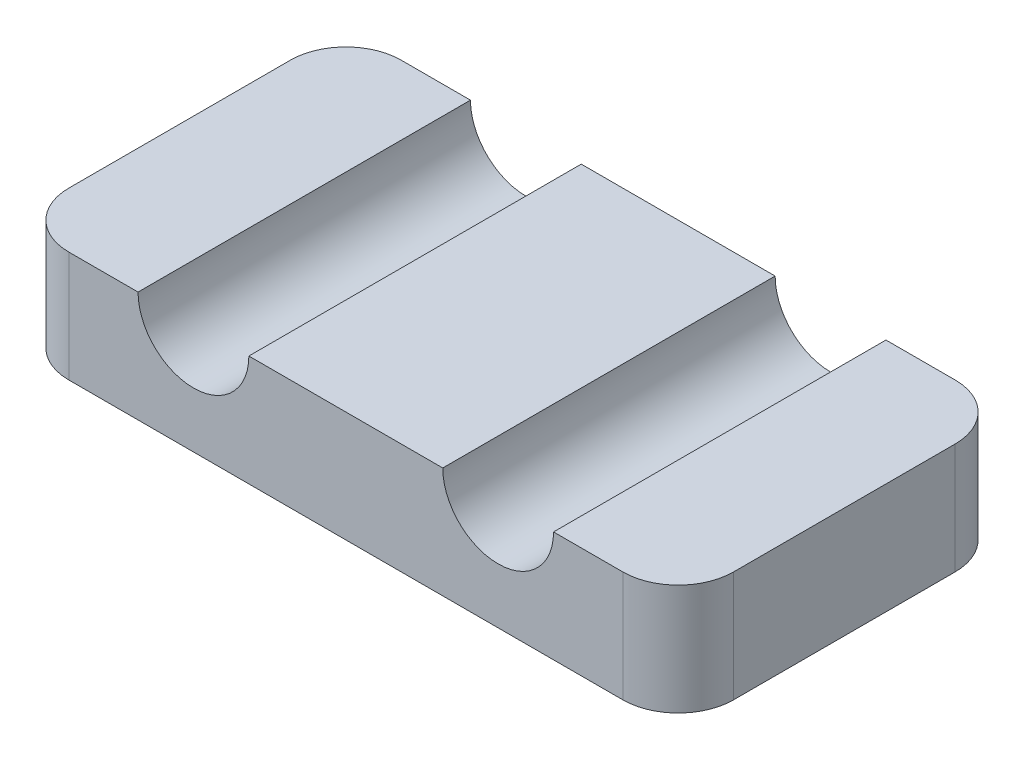
ISO-10303-21;
HEADER;
FILE_DESCRIPTION(('STEP AP214'),'2;1');
FILE_NAME('part.step','',(''),(''),'','','');
FILE_SCHEMA(('AUTOMOTIVE_DESIGN { 1 0 10303 214 1 1 1 1 }'));
ENDSEC;
DATA;
#1=APPLICATION_CONTEXT('core data for automotive mechanical design processes');
#2=APPLICATION_PROTOCOL_DEFINITION('international standard','automotive_design',2000,#1);
#3=PRODUCT_CONTEXT('',#1,'mechanical');
#4=PRODUCT('Part','Part','',(#3));
#5=PRODUCT_RELATED_PRODUCT_CATEGORY('part','',(#4));
#6=PRODUCT_DEFINITION_FORMATION('','',#4);
#7=PRODUCT_DEFINITION_CONTEXT('part definition',#1,'design');
#8=PRODUCT_DEFINITION('design','',#6,#7);
#9=PRODUCT_DEFINITION_SHAPE('','',#8);
#10=(LENGTH_UNIT() NAMED_UNIT(*) SI_UNIT(.MILLI.,.METRE.));
#11=(NAMED_UNIT(*) PLANE_ANGLE_UNIT() SI_UNIT($,.RADIAN.));
#12=(NAMED_UNIT(*) SI_UNIT($,.STERADIAN.) SOLID_ANGLE_UNIT());
#13=UNCERTAINTY_MEASURE_WITH_UNIT(LENGTH_MEASURE(1.E-05),#10,'distance_accuracy_value','');
#14=(GEOMETRIC_REPRESENTATION_CONTEXT(3) GLOBAL_UNCERTAINTY_ASSIGNED_CONTEXT((#13)) GLOBAL_UNIT_ASSIGNED_CONTEXT((#10,
#11,#12)) REPRESENTATION_CONTEXT('',''));
#15=CARTESIAN_POINT('',(0.,0.,0.));
#16=DIRECTION('',(0.,0.,1.));
#17=DIRECTION('',(1.,0.,0.));
#18=AXIS2_PLACEMENT_3D('',#15,#16,#17);
#19=CARTESIAN_POINT('',(69.85,25.4,76.2));
#20=DIRECTION('',(0.,0.,-1.));
#21=DIRECTION('',(-1.,0.,0.));
#22=AXIS2_PLACEMENT_3D('',#19,#20,#21);
#23=CYLINDRICAL_SURFACE('',#22,25.4);
#24=CARTESIAN_POINT('',(69.85,25.4,-76.2));
#25=DIRECTION('',(0.,0.,1.));
#26=DIRECTION('',(1.,0.,0.));
#27=AXIS2_PLACEMENT_3D('',#24,#25,#26);
#28=CIRCLE('',#27,25.4);
#29=CARTESIAN_POINT('',(44.45,25.4,-76.2));
#30=VERTEX_POINT('',#29);
#31=CARTESIAN_POINT('',(95.25,25.4,-76.2));
#32=VERTEX_POINT('',#31);
#33=EDGE_CURVE('E134',#30,#32,#28,.T.);
#34=ORIENTED_EDGE('',*,*,#33,.F.);
#35=DIRECTION('',(0.,0.,-1.));
#36=VECTOR('',#35,1.);
#37=CARTESIAN_POINT('',(44.45,25.4,76.2));
#38=LINE('',#37,#36);
#39=CARTESIAN_POINT('',(44.45,25.4,76.2));
#40=VERTEX_POINT('',#39);
#41=EDGE_CURVE('E129',#40,#30,#38,.T.);
#42=ORIENTED_EDGE('',*,*,#41,.F.);
#43=CARTESIAN_POINT('',(69.85,25.4,76.2));
#44=DIRECTION('',(0.,0.,1.));
#45=DIRECTION('',(1.,0.,0.));
#46=AXIS2_PLACEMENT_3D('',#43,#44,#45);
#47=CIRCLE('',#46,25.4);
#48=CARTESIAN_POINT('',(95.25,25.4,76.2));
#49=VERTEX_POINT('',#48);
#50=EDGE_CURVE('E131',#40,#49,#47,.T.);
#51=ORIENTED_EDGE('',*,*,#50,.T.);
#52=DIRECTION('',(0.,0.,-1.));
#53=VECTOR('',#52,1.);
#54=CARTESIAN_POINT('',(95.25,25.4,76.2));
#55=LINE('',#54,#53);
#56=EDGE_CURVE('E160',#49,#32,#55,.T.);
#57=ORIENTED_EDGE('',*,*,#56,.T.);
#58=EDGE_LOOP('',(#34,#42,#51,#57));
#59=FACE_BOUND('',#58,.T.);
#60=ADVANCED_FACE('F39',(#59),#23,.F.);
#61=CARTESIAN_POINT('',(0.,25.4,76.2));
#62=DIRECTION('',(0.,1.,0.));
#63=DIRECTION('',(0.,0.,1.));
#64=AXIS2_PLACEMENT_3D('',#61,#62,#63);
#65=PLANE('',#64);
#66=DIRECTION('',(1.,0.,0.));
#67=VECTOR('',#66,1.);
#68=CARTESIAN_POINT('',(0.,25.4,-76.2));
#69=LINE('',#68,#67);
#70=CARTESIAN_POINT('',(-44.45,25.4,-76.2));
#71=VERTEX_POINT('',#70);
#72=EDGE_CURVE('E169',#71,#30,#69,.T.);
#73=ORIENTED_EDGE('',*,*,#72,.F.);
#74=DIRECTION('',(0.,0.,-1.));
#75=VECTOR('',#74,1.);
#76=CARTESIAN_POINT('',(-44.45,25.4,76.2));
#77=LINE('',#76,#75);
#78=CARTESIAN_POINT('',(-44.45,25.4,76.2));
#79=VERTEX_POINT('',#78);
#80=EDGE_CURVE('E140',#79,#71,#77,.T.);
#81=ORIENTED_EDGE('',*,*,#80,.F.);
#82=DIRECTION('',(1.,0.,0.));
#83=VECTOR('',#82,1.);
#84=CARTESIAN_POINT('',(0.,25.4,76.2));
#85=LINE('',#84,#83);
#86=EDGE_CURVE('E147',#79,#40,#85,.T.);
#87=ORIENTED_EDGE('',*,*,#86,.T.);
#88=ORIENTED_EDGE('',*,*,#41,.T.);
#89=EDGE_LOOP('',(#73,#81,#87,#88));
#90=FACE_BOUND('',#89,.T.);
#91=ADVANCED_FACE('F154',(#90),#65,.T.);
#92=CARTESIAN_POINT('',(-69.85,25.4,76.2));
#93=DIRECTION('',(0.,0.,-1.));
#94=DIRECTION('',(-1.,0.,0.));
#95=AXIS2_PLACEMENT_3D('',#92,#93,#94);
#96=CYLINDRICAL_SURFACE('',#95,25.4);
#97=CARTESIAN_POINT('',(-69.85,25.4,-76.2));
#98=DIRECTION('',(0.,0.,1.));
#99=DIRECTION('',(1.,0.,0.));
#100=AXIS2_PLACEMENT_3D('',#97,#98,#99);
#101=CIRCLE('',#100,25.4);
#102=CARTESIAN_POINT('',(-95.25,25.4,-76.2));
#103=VERTEX_POINT('',#102);
#104=EDGE_CURVE('E171',#103,#71,#101,.T.);
#105=ORIENTED_EDGE('',*,*,#104,.F.);
#106=DIRECTION('',(0.,0.,-1.));
#107=VECTOR('',#106,1.);
#108=CARTESIAN_POINT('',(-95.25,25.4,76.2));
#109=LINE('',#108,#107);
#110=CARTESIAN_POINT('',(-95.25,25.4,76.2));
#111=VERTEX_POINT('',#110);
#112=EDGE_CURVE('E188',#111,#103,#109,.T.);
#113=ORIENTED_EDGE('',*,*,#112,.F.);
#114=CARTESIAN_POINT('',(-69.85,25.4,76.2));
#115=DIRECTION('',(0.,0.,1.));
#116=DIRECTION('',(1.,0.,0.));
#117=AXIS2_PLACEMENT_3D('',#114,#115,#116);
#118=CIRCLE('',#117,25.4);
#119=EDGE_CURVE('E155',#111,#79,#118,.T.);
#120=ORIENTED_EDGE('',*,*,#119,.T.);
#121=ORIENTED_EDGE('',*,*,#80,.T.);
#122=EDGE_LOOP('',(#105,#113,#120,#121));
#123=FACE_BOUND('',#122,.T.);
#124=ADVANCED_FACE('F251',(#123),#96,.F.);
#125=CARTESIAN_POINT('',(-127.,25.4,-76.2));
#126=VERTEX_POINT('',#125);
#127=EDGE_CURVE('E172',#126,#103,#69,.T.);
#128=ORIENTED_EDGE('',*,*,#127,.F.);
#129=CARTESIAN_POINT('',(-127.,25.4,-50.8));
#130=DIRECTION('',(0.,1.,0.));
#131=DIRECTION('',(0.,0.,1.));
#132=AXIS2_PLACEMENT_3D('',#129,#130,#131);
#133=CIRCLE('',#132,25.4);
#134=CARTESIAN_POINT('',(-152.4,25.4,-50.7999999999999));
#135=VERTEX_POINT('',#134);
#136=EDGE_CURVE('E54',#126,#135,#133,.T.);
#137=ORIENTED_EDGE('',*,*,#136,.T.);
#138=DIRECTION('',(0.,0.,-1.));
#139=VECTOR('',#138,1.);
#140=CARTESIAN_POINT('',(-152.4,25.4,76.2));
#141=LINE('',#140,#139);
#142=CARTESIAN_POINT('',(-152.4,25.4,50.8));
#143=VERTEX_POINT('',#142);
#144=EDGE_CURVE('E186',#143,#135,#141,.T.);
#145=ORIENTED_EDGE('',*,*,#144,.F.);
#146=CARTESIAN_POINT('',(-127.,25.4,50.8));
#147=DIRECTION('',(0.,1.,0.));
#148=DIRECTION('',(0.,0.,1.));
#149=AXIS2_PLACEMENT_3D('',#146,#147,#148);
#150=CIRCLE('',#149,25.4);
#151=CARTESIAN_POINT('',(-127.,25.4,76.2));
#152=VERTEX_POINT('',#151);
#153=EDGE_CURVE('E62',#143,#152,#150,.T.);
#154=ORIENTED_EDGE('',*,*,#153,.T.);
#155=EDGE_CURVE('E157',#152,#111,#85,.T.);
#156=ORIENTED_EDGE('',*,*,#155,.T.);
#157=ORIENTED_EDGE('',*,*,#112,.T.);
#158=EDGE_LOOP('',(#128,#137,#145,#154,#156,#157));
#159=FACE_BOUND('',#158,.T.);
#160=ADVANCED_FACE('F223',(#159),#65,.T.);
#161=CARTESIAN_POINT('',(-152.4,0.,76.2));
#162=DIRECTION('',(-1.,0.,0.));
#163=DIRECTION('',(0.,0.,1.));
#164=AXIS2_PLACEMENT_3D('',#161,#162,#163);
#165=PLANE('',#164);
#166=ORIENTED_EDGE('',*,*,#144,.T.);
#167=DIRECTION('',(0.,1.,0.));
#168=VECTOR('',#167,1.);
#169=CARTESIAN_POINT('',(-152.4,-25.4,-50.8));
#170=LINE('',#169,#168);
#171=CARTESIAN_POINT('',(-152.4,-25.4,-50.7999999999999));
#172=VERTEX_POINT('',#171);
#173=EDGE_CURVE('E11',#135,#172,#170,.F.);
#174=ORIENTED_EDGE('',*,*,#173,.T.);
#175=DIRECTION('',(0.,0.,-1.));
#176=VECTOR('',#175,1.);
#177=CARTESIAN_POINT('',(-152.4,-25.4,76.2));
#178=LINE('',#177,#176);
#179=CARTESIAN_POINT('',(-152.4,-25.4,50.8));
#180=VERTEX_POINT('',#179);
#181=EDGE_CURVE('E183',#180,#172,#178,.T.);
#182=ORIENTED_EDGE('',*,*,#181,.F.);
#183=DIRECTION('',(0.,1.,0.));
#184=VECTOR('',#183,1.);
#185=CARTESIAN_POINT('',(-152.4,0.,50.8));
#186=LINE('',#185,#184);
#187=EDGE_CURVE('E47',#180,#143,#186,.T.);
#188=ORIENTED_EDGE('',*,*,#187,.T.);
#189=EDGE_LOOP('',(#166,#174,#182,#188));
#190=FACE_BOUND('',#189,.T.);
#191=ADVANCED_FACE('F220',(#190),#165,.T.);
#192=CARTESIAN_POINT('',(0.,-25.4,76.2));
#193=DIRECTION('',(0.,1.,0.));
#194=DIRECTION('',(0.,0.,1.));
#195=AXIS2_PLACEMENT_3D('',#192,#193,#194);
#196=PLANE('',#195);
#197=DIRECTION('',(0.,0.,-1.));
#198=VECTOR('',#197,1.);
#199=CARTESIAN_POINT('',(152.4,-25.4,76.2));
#200=LINE('',#199,#198);
#201=CARTESIAN_POINT('',(152.4,-25.4,50.8));
#202=VERTEX_POINT('',#201);
#203=CARTESIAN_POINT('',(152.4,-25.4,-50.7999999999999));
#204=VERTEX_POINT('',#203);
#205=EDGE_CURVE('E180',#202,#204,#200,.T.);
#206=ORIENTED_EDGE('',*,*,#205,.F.);
#207=CARTESIAN_POINT('',(127.,-25.4,50.8));
#208=DIRECTION('',(0.,1.,0.));
#209=DIRECTION('',(0.,0.,1.));
#210=AXIS2_PLACEMENT_3D('',#207,#208,#209);
#211=CIRCLE('',#210,25.4);
#212=CARTESIAN_POINT('',(127.,-25.4,76.2));
#213=VERTEX_POINT('',#212);
#214=EDGE_CURVE('E210',#202,#213,#211,.F.);
#215=ORIENTED_EDGE('',*,*,#214,.T.);
#216=DIRECTION('',(1.,0.,0.));
#217=VECTOR('',#216,1.);
#218=CARTESIAN_POINT('',(0.,-25.4,76.2));
#219=LINE('',#218,#217);
#220=CARTESIAN_POINT('',(-127.,-25.4,76.2));
#221=VERTEX_POINT('',#220);
#222=EDGE_CURVE('E159',#221,#213,#219,.T.);
#223=ORIENTED_EDGE('',*,*,#222,.F.);
#224=CARTESIAN_POINT('',(-127.,-25.4,50.8));
#225=DIRECTION('',(0.,1.,0.));
#226=DIRECTION('',(0.,0.,1.));
#227=AXIS2_PLACEMENT_3D('',#224,#225,#226);
#228=CIRCLE('',#227,25.4);
#229=EDGE_CURVE('E204',#221,#180,#228,.F.);
#230=ORIENTED_EDGE('',*,*,#229,.T.);
#231=ORIENTED_EDGE('',*,*,#181,.T.);
#232=CARTESIAN_POINT('',(-127.,-25.4,-50.8));
#233=DIRECTION('',(0.,1.,0.));
#234=DIRECTION('',(0.,0.,1.));
#235=AXIS2_PLACEMENT_3D('',#232,#233,#234);
#236=CIRCLE('',#235,25.4);
#237=CARTESIAN_POINT('',(-127.,-25.4,-76.2));
#238=VERTEX_POINT('',#237);
#239=EDGE_CURVE('E206',#172,#238,#236,.F.);
#240=ORIENTED_EDGE('',*,*,#239,.T.);
#241=DIRECTION('',(1.,0.,0.));
#242=VECTOR('',#241,1.);
#243=CARTESIAN_POINT('',(0.,-25.4,-76.2));
#244=LINE('',#243,#242);
#245=CARTESIAN_POINT('',(127.,-25.4,-76.2));
#246=VERTEX_POINT('',#245);
#247=EDGE_CURVE('E175',#238,#246,#244,.T.);
#248=ORIENTED_EDGE('',*,*,#247,.T.);
#249=CARTESIAN_POINT('',(127.,-25.4,-50.8));
#250=DIRECTION('',(0.,1.,0.));
#251=DIRECTION('',(0.,0.,1.));
#252=AXIS2_PLACEMENT_3D('',#249,#250,#251);
#253=CIRCLE('',#252,25.4);
#254=EDGE_CURVE('E208',#246,#204,#253,.F.);
#255=ORIENTED_EDGE('',*,*,#254,.T.);
#256=EDGE_LOOP('',(#206,#215,#223,#230,#231,#240,#248,#255));
#257=FACE_BOUND('',#256,.T.);
#258=ADVANCED_FACE('F228',(#257),#196,.F.);
#259=CARTESIAN_POINT('',(152.4,0.,76.2));
#260=DIRECTION('',(-1.,0.,0.));
#261=DIRECTION('',(0.,0.,1.));
#262=AXIS2_PLACEMENT_3D('',#259,#260,#261);
#263=PLANE('',#262);
#264=DIRECTION('',(0.,0.,-1.));
#265=VECTOR('',#264,1.);
#266=CARTESIAN_POINT('',(152.4,25.4,76.2));
#267=LINE('',#266,#265);
#268=CARTESIAN_POINT('',(152.4,25.4,50.8));
#269=VERTEX_POINT('',#268);
#270=CARTESIAN_POINT('',(152.4,25.4,-50.7999999999999));
#271=VERTEX_POINT('',#270);
#272=EDGE_CURVE('E162',#269,#271,#267,.T.);
#273=ORIENTED_EDGE('',*,*,#272,.F.);
#274=DIRECTION('',(0.,1.,0.));
#275=VECTOR('',#274,1.);
#276=CARTESIAN_POINT('',(152.4,-25.4,50.8));
#277=LINE('',#276,#275);
#278=EDGE_CURVE('E202',#269,#202,#277,.F.);
#279=ORIENTED_EDGE('',*,*,#278,.T.);
#280=ORIENTED_EDGE('',*,*,#205,.T.);
#281=DIRECTION('',(0.,1.,0.));
#282=VECTOR('',#281,1.);
#283=CARTESIAN_POINT('',(152.4,0.,-50.8));
#284=LINE('',#283,#282);
#285=EDGE_CURVE('E199',#204,#271,#284,.T.);
#286=ORIENTED_EDGE('',*,*,#285,.T.);
#287=EDGE_LOOP('',(#273,#279,#280,#286));
#288=FACE_BOUND('',#287,.T.);
#289=ADVANCED_FACE('F237',(#288),#263,.F.);
#290=CARTESIAN_POINT('',(127.,25.4,76.2));
#291=VERTEX_POINT('',#290);
#292=EDGE_CURVE('E151',#49,#291,#85,.T.);
#293=ORIENTED_EDGE('',*,*,#292,.T.);
#294=CARTESIAN_POINT('',(127.,25.4,50.8));
#295=DIRECTION('',(0.,1.,0.));
#296=DIRECTION('',(0.,0.,1.));
#297=AXIS2_PLACEMENT_3D('',#294,#295,#296);
#298=CIRCLE('',#297,25.4);
#299=EDGE_CURVE('E197',#291,#269,#298,.T.);
#300=ORIENTED_EDGE('',*,*,#299,.T.);
#301=ORIENTED_EDGE('',*,*,#272,.T.);
#302=CARTESIAN_POINT('',(127.,25.4,-50.8));
#303=DIRECTION('',(0.,1.,0.));
#304=DIRECTION('',(0.,0.,1.));
#305=AXIS2_PLACEMENT_3D('',#302,#303,#304);
#306=CIRCLE('',#305,25.4);
#307=CARTESIAN_POINT('',(127.,25.4,-76.2));
#308=VERTEX_POINT('',#307);
#309=EDGE_CURVE('E195',#271,#308,#306,.T.);
#310=ORIENTED_EDGE('',*,*,#309,.T.);
#311=EDGE_CURVE('E152',#32,#308,#69,.T.);
#312=ORIENTED_EDGE('',*,*,#311,.F.);
#313=ORIENTED_EDGE('',*,*,#56,.F.);
#314=EDGE_LOOP('',(#293,#300,#301,#310,#312,#313));
#315=FACE_BOUND('',#314,.T.);
#316=ADVANCED_FACE('F235',(#315),#65,.T.);
#317=CARTESIAN_POINT('',(0.,0.,76.2));
#318=DIRECTION('',(0.,0.,1.));
#319=DIRECTION('',(1.,0.,0.));
#320=AXIS2_PLACEMENT_3D('',#317,#318,#319);
#321=PLANE('',#320);
#322=ORIENTED_EDGE('',*,*,#222,.T.);
#323=DIRECTION('',(0.,1.,0.));
#324=VECTOR('',#323,1.);
#325=CARTESIAN_POINT('',(127.,25.4,76.2));
#326=LINE('',#325,#324);
#327=EDGE_CURVE('E193',#213,#291,#326,.T.);
#328=ORIENTED_EDGE('',*,*,#327,.T.);
#329=ORIENTED_EDGE('',*,*,#292,.F.);
#330=ORIENTED_EDGE('',*,*,#50,.F.);
#331=ORIENTED_EDGE('',*,*,#86,.F.);
#332=ORIENTED_EDGE('',*,*,#119,.F.);
#333=ORIENTED_EDGE('',*,*,#155,.F.);
#334=DIRECTION('',(0.,1.,0.));
#335=VECTOR('',#334,1.);
#336=CARTESIAN_POINT('',(-127.,0.,76.2));
#337=LINE('',#336,#335);
#338=EDGE_CURVE('E139',#152,#221,#337,.F.);
#339=ORIENTED_EDGE('',*,*,#338,.T.);
#340=EDGE_LOOP('',(#322,#328,#329,#330,#331,#332,#333,#339));
#341=FACE_BOUND('',#340,.T.);
#342=ADVANCED_FACE('F145',(#341),#321,.T.);
#343=CARTESIAN_POINT('',(0.,0.,-76.2));
#344=DIRECTION('',(0.,0.,1.));
#345=DIRECTION('',(1.,0.,0.));
#346=AXIS2_PLACEMENT_3D('',#343,#344,#345);
#347=PLANE('',#346);
#348=ORIENTED_EDGE('',*,*,#311,.T.);
#349=DIRECTION('',(0.,1.,0.));
#350=VECTOR('',#349,1.);
#351=CARTESIAN_POINT('',(127.,0.,-76.2));
#352=LINE('',#351,#350);
#353=EDGE_CURVE('E215',#308,#246,#352,.F.);
#354=ORIENTED_EDGE('',*,*,#353,.T.);
#355=ORIENTED_EDGE('',*,*,#247,.F.);
#356=DIRECTION('',(0.,1.,0.));
#357=VECTOR('',#356,1.);
#358=CARTESIAN_POINT('',(-127.,25.4,-76.2));
#359=LINE('',#358,#357);
#360=EDGE_CURVE('E212',#238,#126,#359,.T.);
#361=ORIENTED_EDGE('',*,*,#360,.T.);
#362=ORIENTED_EDGE('',*,*,#127,.T.);
#363=ORIENTED_EDGE('',*,*,#104,.T.);
#364=ORIENTED_EDGE('',*,*,#72,.T.);
#365=ORIENTED_EDGE('',*,*,#33,.T.);
#366=EDGE_LOOP('',(#348,#354,#355,#361,#362,#363,#364,#365));
#367=FACE_BOUND('',#366,.T.);
#368=ADVANCED_FACE('F246',(#367),#347,.F.);
#369=CARTESIAN_POINT('',(127.,0.,50.8));
#370=DIRECTION('',(0.,-1.,0.));
#371=DIRECTION('',(0.,0.,-1.));
#372=AXIS2_PLACEMENT_3D('',#369,#370,#371);
#373=CYLINDRICAL_SURFACE('',#372,25.4);
#374=ORIENTED_EDGE('',*,*,#214,.F.);
#375=ORIENTED_EDGE('',*,*,#278,.F.);
#376=ORIENTED_EDGE('',*,*,#299,.F.);
#377=ORIENTED_EDGE('',*,*,#327,.F.);
#378=EDGE_LOOP('',(#374,#375,#376,#377));
#379=FACE_BOUND('',#378,.T.);
#380=ADVANCED_FACE('F233',(#379),#373,.T.);
#381=CARTESIAN_POINT('',(127.,0.,-50.8));
#382=DIRECTION('',(0.,1.,0.));
#383=DIRECTION('',(0.,0.,1.));
#384=AXIS2_PLACEMENT_3D('',#381,#382,#383);
#385=CYLINDRICAL_SURFACE('',#384,25.4);
#386=ORIENTED_EDGE('',*,*,#254,.F.);
#387=ORIENTED_EDGE('',*,*,#353,.F.);
#388=ORIENTED_EDGE('',*,*,#309,.F.);
#389=ORIENTED_EDGE('',*,*,#285,.F.);
#390=EDGE_LOOP('',(#386,#387,#388,#389));
#391=FACE_BOUND('',#390,.T.);
#392=ADVANCED_FACE('F241',(#391),#385,.T.);
#393=CARTESIAN_POINT('',(-127.,0.,-50.8));
#394=DIRECTION('',(0.,-1.,0.));
#395=DIRECTION('',(0.,0.,-1.));
#396=AXIS2_PLACEMENT_3D('',#393,#394,#395);
#397=CYLINDRICAL_SURFACE('',#396,25.4);
#398=ORIENTED_EDGE('',*,*,#239,.F.);
#399=ORIENTED_EDGE('',*,*,#173,.F.);
#400=ORIENTED_EDGE('',*,*,#136,.F.);
#401=ORIENTED_EDGE('',*,*,#360,.F.);
#402=EDGE_LOOP('',(#398,#399,#400,#401));
#403=FACE_BOUND('',#402,.T.);
#404=ADVANCED_FACE('F268',(#403),#397,.T.);
#405=CARTESIAN_POINT('',(-127.,0.,50.8));
#406=DIRECTION('',(0.,1.,0.));
#407=DIRECTION('',(0.,0.,1.));
#408=AXIS2_PLACEMENT_3D('',#405,#406,#407);
#409=CYLINDRICAL_SURFACE('',#408,25.4);
#410=ORIENTED_EDGE('',*,*,#229,.F.);
#411=ORIENTED_EDGE('',*,*,#338,.F.);
#412=ORIENTED_EDGE('',*,*,#153,.F.);
#413=ORIENTED_EDGE('',*,*,#187,.F.);
#414=EDGE_LOOP('',(#410,#411,#412,#413));
#415=FACE_BOUND('',#414,.T.);
#416=ADVANCED_FACE('F41',(#415),#409,.T.);
#417=CLOSED_SHELL('',(#60,#91,#124,#160,#191,#258,#289,#316,#342,#368,#380,#392,#404,#416));
#418=MANIFOLD_SOLID_BREP('B2',#417);
#419=ADVANCED_BREP_SHAPE_REPRESENTATION('',(#18,#418),#14);
#420=SHAPE_DEFINITION_REPRESENTATION(#9,#419);
ENDSEC;
END-ISO-10303-21;
